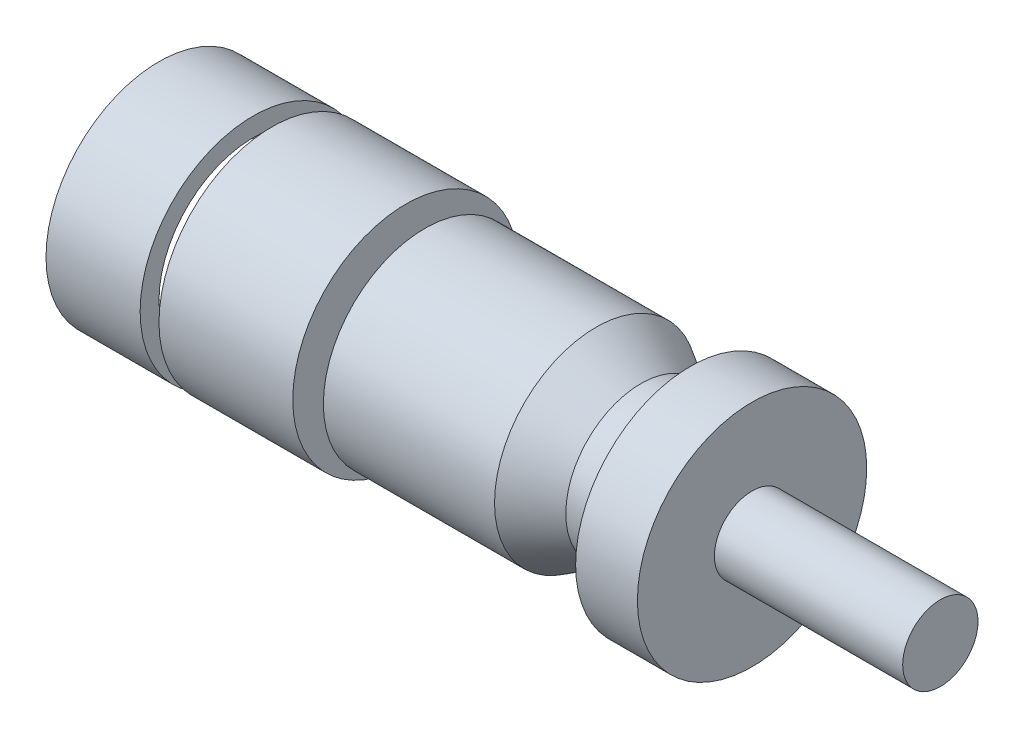
ISO-10303-21;
HEADER;
FILE_DESCRIPTION(('STEP AP214'),'2;1');
FILE_NAME('part.step','',(''),(''),'','','');
FILE_SCHEMA(('AUTOMOTIVE_DESIGN { 1 0 10303 214 1 1 1 1 }'));
ENDSEC;
DATA;
#1=APPLICATION_CONTEXT('core data for automotive mechanical design processes');
#2=APPLICATION_PROTOCOL_DEFINITION('international standard','automotive_design',2000,#1);
#3=PRODUCT_CONTEXT('',#1,'mechanical');
#4=PRODUCT('Part','Part','',(#3));
#5=PRODUCT_RELATED_PRODUCT_CATEGORY('part','',(#4));
#6=PRODUCT_DEFINITION_FORMATION('','',#4);
#7=PRODUCT_DEFINITION_CONTEXT('part definition',#1,'design');
#8=PRODUCT_DEFINITION('design','',#6,#7);
#9=PRODUCT_DEFINITION_SHAPE('','',#8);
#10=(LENGTH_UNIT() NAMED_UNIT(*) SI_UNIT(.MILLI.,.METRE.));
#11=(NAMED_UNIT(*) PLANE_ANGLE_UNIT() SI_UNIT($,.RADIAN.));
#12=(NAMED_UNIT(*) SI_UNIT($,.STERADIAN.) SOLID_ANGLE_UNIT());
#13=UNCERTAINTY_MEASURE_WITH_UNIT(LENGTH_MEASURE(1.E-05),#10,'distance_accuracy_value','');
#14=(GEOMETRIC_REPRESENTATION_CONTEXT(3) GLOBAL_UNCERTAINTY_ASSIGNED_CONTEXT((#13)) GLOBAL_UNIT_ASSIGNED_CONTEXT((#10,
#11,#12)) REPRESENTATION_CONTEXT('',''));
#15=CARTESIAN_POINT('',(0.,0.,0.));
#16=DIRECTION('',(0.,0.,1.));
#17=DIRECTION('',(1.,0.,0.));
#18=AXIS2_PLACEMENT_3D('',#15,#16,#17);
#19=CARTESIAN_POINT('',(63.,12.1795573404222,0.));
#20=DIRECTION('',(-1.,0.,0.));
#21=DIRECTION('',(0.,0.,1.));
#22=AXIS2_PLACEMENT_3D('',#19,#20,#21);
#23=PLANE('',#22);
#24=CARTESIAN_POINT('',(63.,0.,0.));
#25=DIRECTION('',(-1.,0.,0.));
#26=DIRECTION('',(0.,0.,1.));
#27=AXIS2_PLACEMENT_3D('',#24,#25,#26);
#28=CIRCLE('',#27,12.1795573404222);
#29=CARTESIAN_POINT('',(63.,0.,12.1795573404222));
#30=VERTEX_POINT('',#29);
#31=EDGE_CURVE('E52',#30,#30,#28,.T.);
#32=ORIENTED_EDGE('',*,*,#31,.F.);
#33=EDGE_LOOP('',(#32));
#34=FACE_BOUND('',#33,.T.);
#35=CARTESIAN_POINT('',(63.,0.,0.));
#36=DIRECTION('',(-1.,0.,0.));
#37=DIRECTION('',(0.,0.,1.));
#38=AXIS2_PLACEMENT_3D('',#35,#36,#37);
#39=CIRCLE('',#38,4.);
#40=CARTESIAN_POINT('',(63.,0.,4.));
#41=VERTEX_POINT('',#40);
#42=EDGE_CURVE('E11',#41,#41,#39,.F.);
#43=ORIENTED_EDGE('',*,*,#42,.F.);
#44=EDGE_LOOP('',(#43));
#45=FACE_BOUND('',#44,.T.);
#46=ADVANCED_FACE('F41',(#34,#45),#23,.F.);
#47=CARTESIAN_POINT('',(0.,0.,0.));
#48=DIRECTION('',(-1.,0.,0.));
#49=DIRECTION('',(0.,0.,1.));
#50=AXIS2_PLACEMENT_3D('',#47,#48,#49);
#51=CYLINDRICAL_SURFACE('',#50,5.17137842644598);
#52=CARTESIAN_POINT('',(10.,0.,0.));
#53=DIRECTION('',(-1.,0.,0.));
#54=DIRECTION('',(0.,0.,1.));
#55=AXIS2_PLACEMENT_3D('',#52,#53,#54);
#56=CIRCLE('',#55,5.17137842644598);
#57=CARTESIAN_POINT('',(10.,0.,5.17137842644598));
#58=VERTEX_POINT('',#57);
#59=EDGE_CURVE('E48',#58,#58,#56,.T.);
#60=ORIENTED_EDGE('',*,*,#59,.F.);
#61=EDGE_LOOP('',(#60));
#62=FACE_BOUND('',#61,.T.);
#63=CARTESIAN_POINT('',(12.,0.,0.));
#64=DIRECTION('',(-1.,0.,0.));
#65=DIRECTION('',(0.,0.,1.));
#66=AXIS2_PLACEMENT_3D('',#63,#64,#65);
#67=CIRCLE('',#66,5.17137842644598);
#68=CARTESIAN_POINT('',(12.,0.,5.17137842644598));
#69=VERTEX_POINT('',#68);
#70=EDGE_CURVE('E85',#69,#69,#67,.T.);
#71=ORIENTED_EDGE('',*,*,#70,.T.);
#72=EDGE_LOOP('',(#71));
#73=FACE_BOUND('',#72,.T.);
#74=ADVANCED_FACE('F106',(#62,#73),#51,.T.);
#75=CARTESIAN_POINT('',(12.,5.17137842644598,0.));
#76=DIRECTION('',(1.,0.,0.));
#77=DIRECTION('',(0.,0.,-1.));
#78=AXIS2_PLACEMENT_3D('',#75,#76,#77);
#79=PLANE('',#78);
#80=ORIENTED_EDGE('',*,*,#70,.F.);
#81=EDGE_LOOP('',(#80));
#82=FACE_BOUND('',#81,.T.);
#83=CARTESIAN_POINT('',(12.,0.,0.));
#84=DIRECTION('',(-1.,0.,0.));
#85=DIRECTION('',(0.,0.,1.));
#86=AXIS2_PLACEMENT_3D('',#83,#84,#85);
#87=CIRCLE('',#86,12.);
#88=CARTESIAN_POINT('',(12.,0.,12.));
#89=VERTEX_POINT('',#88);
#90=EDGE_CURVE('E82',#89,#89,#87,.T.);
#91=ORIENTED_EDGE('',*,*,#90,.T.);
#92=EDGE_LOOP('',(#91));
#93=FACE_BOUND('',#92,.T.);
#94=ADVANCED_FACE('F112',(#82,#93),#79,.F.);
#95=CARTESIAN_POINT('',(0.,0.,0.));
#96=DIRECTION('',(-1.,0.,0.));
#97=DIRECTION('',(0.,0.,1.));
#98=AXIS2_PLACEMENT_3D('',#95,#96,#97);
#99=CYLINDRICAL_SURFACE('',#98,12.);
#100=ORIENTED_EDGE('',*,*,#90,.F.);
#101=EDGE_LOOP('',(#100));
#102=FACE_BOUND('',#101,.T.);
#103=CARTESIAN_POINT('',(26.2135902893891,0.,0.));
#104=DIRECTION('',(-1.,0.,0.));
#105=DIRECTION('',(0.,0.,1.));
#106=AXIS2_PLACEMENT_3D('',#103,#104,#105);
#107=CIRCLE('',#106,12.);
#108=CARTESIAN_POINT('',(26.2135902893891,0.,12.));
#109=VERTEX_POINT('',#108);
#110=EDGE_CURVE('E79',#109,#109,#107,.T.);
#111=ORIENTED_EDGE('',*,*,#110,.T.);
#112=EDGE_LOOP('',(#111));
#113=FACE_BOUND('',#112,.T.);
#114=ADVANCED_FACE('F147',(#102,#113),#99,.T.);
#115=CARTESIAN_POINT('',(26.2135902893891,12.,0.));
#116=DIRECTION('',(-1.,0.,0.));
#117=DIRECTION('',(0.,0.,1.));
#118=AXIS2_PLACEMENT_3D('',#115,#116,#117);
#119=PLANE('',#118);
#120=ORIENTED_EDGE('',*,*,#110,.F.);
#121=EDGE_LOOP('',(#120));
#122=FACE_BOUND('',#121,.T.);
#123=CARTESIAN_POINT('',(26.2135902893891,0.,0.));
#124=DIRECTION('',(-1.,0.,0.));
#125=DIRECTION('',(0.,0.,1.));
#126=AXIS2_PLACEMENT_3D('',#123,#124,#125);
#127=CIRCLE('',#126,5.17137842644598);
#128=CARTESIAN_POINT('',(26.2135902893891,0.,5.17137842644598));
#129=VERTEX_POINT('',#128);
#130=EDGE_CURVE('E76',#129,#129,#127,.T.);
#131=ORIENTED_EDGE('',*,*,#130,.T.);
#132=EDGE_LOOP('',(#131));
#133=FACE_BOUND('',#132,.T.);
#134=ADVANCED_FACE('F143',(#122,#133),#119,.F.);
#135=CARTESIAN_POINT('',(0.,0.,0.));
#136=DIRECTION('',(-1.,0.,0.));
#137=DIRECTION('',(0.,0.,1.));
#138=AXIS2_PLACEMENT_3D('',#135,#136,#137);
#139=CYLINDRICAL_SURFACE('',#138,5.17137842644598);
#140=ORIENTED_EDGE('',*,*,#130,.F.);
#141=EDGE_LOOP('',(#140));
#142=FACE_BOUND('',#141,.T.);
#143=CARTESIAN_POINT('',(28.2581179786321,0.,0.));
#144=DIRECTION('',(-1.,0.,0.));
#145=DIRECTION('',(0.,0.,1.));
#146=AXIS2_PLACEMENT_3D('',#143,#144,#145);
#147=CIRCLE('',#146,5.17137842644598);
#148=CARTESIAN_POINT('',(28.2581179786321,0.,5.17137842644598));
#149=VERTEX_POINT('',#148);
#150=EDGE_CURVE('E73',#149,#149,#147,.T.);
#151=ORIENTED_EDGE('',*,*,#150,.T.);
#152=EDGE_LOOP('',(#151));
#153=FACE_BOUND('',#152,.T.);
#154=ADVANCED_FACE('F139',(#142,#153),#139,.T.);
#155=CARTESIAN_POINT('',(28.2581179786321,5.17137842644598,0.));
#156=DIRECTION('',(1.,0.,0.));
#157=DIRECTION('',(0.,0.,-1.));
#158=AXIS2_PLACEMENT_3D('',#155,#156,#157);
#159=PLANE('',#158);
#160=ORIENTED_EDGE('',*,*,#150,.F.);
#161=EDGE_LOOP('',(#160));
#162=FACE_BOUND('',#161,.T.);
#163=CARTESIAN_POINT('',(28.2581179786321,0.,0.));
#164=DIRECTION('',(-1.,0.,0.));
#165=DIRECTION('',(0.,0.,1.));
#166=AXIS2_PLACEMENT_3D('',#163,#164,#165);
#167=CIRCLE('',#166,10.7951880008785);
#168=CARTESIAN_POINT('',(28.2581179786321,0.,10.7951880008785));
#169=VERTEX_POINT('',#168);
#170=EDGE_CURVE('E70',#169,#169,#167,.T.);
#171=ORIENTED_EDGE('',*,*,#170,.T.);
#172=EDGE_LOOP('',(#171));
#173=FACE_BOUND('',#172,.T.);
#174=ADVANCED_FACE('F135',(#162,#173),#159,.F.);
#175=CARTESIAN_POINT('',(0.,0.,0.));
#176=DIRECTION('',(-1.,0.,0.));
#177=DIRECTION('',(0.,0.,1.));
#178=AXIS2_PLACEMENT_3D('',#175,#176,#177);
#179=CYLINDRICAL_SURFACE('',#178,10.7951880008785);
#180=ORIENTED_EDGE('',*,*,#170,.F.);
#181=EDGE_LOOP('',(#180));
#182=FACE_BOUND('',#181,.T.);
#183=CARTESIAN_POINT('',(46.4383051191294,0.,0.));
#184=DIRECTION('',(-1.,0.,0.));
#185=DIRECTION('',(0.,0.,1.));
#186=AXIS2_PLACEMENT_3D('',#183,#184,#185);
#187=CIRCLE('',#186,10.7951880008785);
#188=CARTESIAN_POINT('',(46.4383051191294,0.,10.7951880008785));
#189=VERTEX_POINT('',#188);
#190=EDGE_CURVE('E67',#189,#189,#187,.T.);
#191=ORIENTED_EDGE('',*,*,#190,.T.);
#192=EDGE_LOOP('',(#191));
#193=FACE_BOUND('',#192,.T.);
#194=ADVANCED_FACE('F131',(#182,#193),#179,.T.);
#195=CARTESIAN_POINT('',(51.1946219555419,0.,0.));
#196=DIRECTION('',(-1.,0.,0.));
#197=DIRECTION('',(0.,0.,1.));
#198=AXIS2_PLACEMENT_3D('',#195,#196,#197);
#199=CONICAL_SURFACE('',#198,7.98110914310926,0.534257794337086);
#200=ORIENTED_EDGE('',*,*,#190,.F.);
#201=EDGE_LOOP('',(#200));
#202=FACE_BOUND('',#201,.T.);
#203=CARTESIAN_POINT('',(51.1946219555419,0.,0.));
#204=DIRECTION('',(-1.,0.,0.));
#205=DIRECTION('',(0.,0.,1.));
#206=AXIS2_PLACEMENT_3D('',#203,#204,#205);
#207=CIRCLE('',#206,7.98110914310926);
#208=CARTESIAN_POINT('',(51.1946219555419,0.,7.98110914310926));
#209=VERTEX_POINT('',#208);
#210=EDGE_CURVE('E64',#209,#209,#207,.T.);
#211=ORIENTED_EDGE('',*,*,#210,.T.);
#212=EDGE_LOOP('',(#211));
#213=FACE_BOUND('',#212,.T.);
#214=ADVANCED_FACE('F127',(#202,#213),#199,.T.);
#215=CARTESIAN_POINT('',(0.,0.,0.));
#216=DIRECTION('',(-1.,0.,0.));
#217=DIRECTION('',(0.,0.,1.));
#218=AXIS2_PLACEMENT_3D('',#215,#216,#217);
#219=CYLINDRICAL_SURFACE('',#218,7.98110914310926);
#220=ORIENTED_EDGE('',*,*,#210,.F.);
#221=EDGE_LOOP('',(#220));
#222=FACE_BOUND('',#221,.T.);
#223=CARTESIAN_POINT('',(56.4378467619837,0.,0.));
#224=DIRECTION('',(-1.,0.,0.));
#225=DIRECTION('',(0.,0.,1.));
#226=AXIS2_PLACEMENT_3D('',#223,#224,#225);
#227=CIRCLE('',#226,7.98110914310926);
#228=CARTESIAN_POINT('',(56.4378467619837,0.,7.98110914310926));
#229=VERTEX_POINT('',#228);
#230=EDGE_CURVE('E61',#229,#229,#227,.T.);
#231=ORIENTED_EDGE('',*,*,#230,.T.);
#232=EDGE_LOOP('',(#231));
#233=FACE_BOUND('',#232,.T.);
#234=ADVANCED_FACE('F123',(#222,#233),#219,.T.);
#235=CARTESIAN_POINT('',(56.4378467619837,7.98110914310926,0.));
#236=DIRECTION('',(1.,0.,0.));
#237=DIRECTION('',(0.,0.,-1.));
#238=AXIS2_PLACEMENT_3D('',#235,#236,#237);
#239=PLANE('',#238);
#240=ORIENTED_EDGE('',*,*,#230,.F.);
#241=EDGE_LOOP('',(#240));
#242=FACE_BOUND('',#241,.T.);
#243=CARTESIAN_POINT('',(56.4378467619837,0.,0.));
#244=DIRECTION('',(-1.,0.,0.));
#245=DIRECTION('',(0.,0.,1.));
#246=AXIS2_PLACEMENT_3D('',#243,#244,#245);
#247=CIRCLE('',#246,12.1795573404222);
#248=CARTESIAN_POINT('',(56.4378467619837,0.,12.1795573404222));
#249=VERTEX_POINT('',#248);
#250=EDGE_CURVE('E56',#249,#249,#247,.T.);
#251=ORIENTED_EDGE('',*,*,#250,.T.);
#252=EDGE_LOOP('',(#251));
#253=FACE_BOUND('',#252,.T.);
#254=ADVANCED_FACE('F119',(#242,#253),#239,.F.);
#255=CARTESIAN_POINT('',(0.,0.,0.));
#256=DIRECTION('',(-1.,0.,0.));
#257=DIRECTION('',(0.,0.,1.));
#258=AXIS2_PLACEMENT_3D('',#255,#256,#257);
#259=CYLINDRICAL_SURFACE('',#258,12.1795573404222);
#260=ORIENTED_EDGE('',*,*,#250,.F.);
#261=EDGE_LOOP('',(#260));
#262=FACE_BOUND('',#261,.T.);
#263=ORIENTED_EDGE('',*,*,#31,.T.);
#264=EDGE_LOOP('',(#263));
#265=FACE_BOUND('',#264,.T.);
#266=ADVANCED_FACE('F103',(#262,#265),#259,.T.);
#267=CARTESIAN_POINT('',(10.,0.,0.));
#268=DIRECTION('',(-1.,0.,0.));
#269=DIRECTION('',(0.,0.,1.));
#270=AXIS2_PLACEMENT_3D('',#267,#268,#269);
#271=PLANE('',#270);
#272=ORIENTED_EDGE('',*,*,#59,.T.);
#273=EDGE_LOOP('',(#272));
#274=FACE_BOUND('',#273,.T.);
#275=ADVANCED_FACE('F43',(#274),#271,.T.);
#276=CARTESIAN_POINT('',(83.,0.,0.));
#277=DIRECTION('',(-1.,0.,0.));
#278=DIRECTION('',(0.,0.,1.));
#279=AXIS2_PLACEMENT_3D('',#276,#277,#278);
#280=CYLINDRICAL_SURFACE('',#279,4.);
#281=CARTESIAN_POINT('',(83.,0.,0.));
#282=DIRECTION('',(1.,0.,0.));
#283=DIRECTION('',(0.,0.,-1.));
#284=AXIS2_PLACEMENT_3D('',#281,#282,#283);
#285=CIRCLE('',#284,4.);
#286=CARTESIAN_POINT('',(83.,0.,-4.));
#287=VERTEX_POINT('',#286);
#288=EDGE_CURVE('E88',#287,#287,#285,.T.);
#289=ORIENTED_EDGE('',*,*,#288,.F.);
#290=EDGE_LOOP('',(#289));
#291=FACE_BOUND('',#290,.T.);
#292=ORIENTED_EDGE('',*,*,#42,.T.);
#293=EDGE_LOOP('',(#292));
#294=FACE_BOUND('',#293,.T.);
#295=ADVANCED_FACE('F94',(#291,#294),#280,.T.);
#296=CARTESIAN_POINT('',(83.,0.,0.));
#297=DIRECTION('',(1.,0.,0.));
#298=DIRECTION('',(0.,0.,-1.));
#299=AXIS2_PLACEMENT_3D('',#296,#297,#298);
#300=PLANE('',#299);
#301=ORIENTED_EDGE('',*,*,#288,.T.);
#302=EDGE_LOOP('',(#301));
#303=FACE_BOUND('',#302,.T.);
#304=ADVANCED_FACE('F92',(#303),#300,.T.);
#305=CLOSED_SHELL('',(#46,#74,#94,#114,#134,#154,#174,#194,#214,#234,#254,#266,#275,#295,#304));
#306=MANIFOLD_SOLID_BREP('B2',#305);
#307=CARTESIAN_POINT('',(0.,0.,0.));
#308=DIRECTION('',(1.,0.,0.));
#309=DIRECTION('',(0.,0.,-1.));
#310=AXIS2_PLACEMENT_3D('',#307,#308,#309);
#311=PLANE('',#310);
#312=CARTESIAN_POINT('',(0.,0.,0.));
#313=DIRECTION('',(-1.,0.,0.));
#314=DIRECTION('',(0.,0.,1.));
#315=AXIS2_PLACEMENT_3D('',#312,#313,#314);
#316=CIRCLE('',#315,10.);
#317=CARTESIAN_POINT('',(0.,0.,10.));
#318=VERTEX_POINT('',#317);
#319=EDGE_CURVE('E275',#318,#318,#316,.T.);
#320=ORIENTED_EDGE('',*,*,#319,.F.);
#321=EDGE_LOOP('',(#320));
#322=FACE_BOUND('',#321,.T.);
#323=CARTESIAN_POINT('',(0.,0.,0.));
#324=DIRECTION('',(-1.,0.,0.));
#325=DIRECTION('',(0.,0.,1.));
#326=AXIS2_PLACEMENT_3D('',#323,#324,#325);
#327=CIRCLE('',#326,12.);
#328=CARTESIAN_POINT('',(0.,0.,12.));
#329=VERTEX_POINT('',#328);
#330=EDGE_CURVE('E40',#329,#329,#327,.T.);
#331=ORIENTED_EDGE('',*,*,#330,.T.);
#332=EDGE_LOOP('',(#331));
#333=FACE_BOUND('',#332,.T.);
#334=ADVANCED_FACE('F261',(#322,#333),#311,.F.);
#335=CARTESIAN_POINT('',(0.,0.,0.));
#336=DIRECTION('',(-1.,0.,0.));
#337=DIRECTION('',(0.,0.,1.));
#338=AXIS2_PLACEMENT_3D('',#335,#336,#337);
#339=CYLINDRICAL_SURFACE('',#338,12.);
#340=ORIENTED_EDGE('',*,*,#330,.F.);
#341=EDGE_LOOP('',(#340));
#342=FACE_BOUND('',#341,.T.);
#343=CARTESIAN_POINT('',(10.,0.,0.));
#344=DIRECTION('',(-1.,0.,0.));
#345=DIRECTION('',(0.,0.,1.));
#346=AXIS2_PLACEMENT_3D('',#343,#344,#345);
#347=CIRCLE('',#346,12.);
#348=CARTESIAN_POINT('',(10.,0.,12.));
#349=VERTEX_POINT('',#348);
#350=EDGE_CURVE('E267',#349,#349,#347,.T.);
#351=ORIENTED_EDGE('',*,*,#350,.T.);
#352=EDGE_LOOP('',(#351));
#353=FACE_BOUND('',#352,.T.);
#354=ADVANCED_FACE('F284',(#342,#353),#339,.T.);
#355=CARTESIAN_POINT('',(10.,12.,0.));
#356=DIRECTION('',(-1.,0.,0.));
#357=DIRECTION('',(0.,0.,1.));
#358=AXIS2_PLACEMENT_3D('',#355,#356,#357);
#359=PLANE('',#358);
#360=CARTESIAN_POINT('',(10.,0.,0.));
#361=DIRECTION('',(-1.,0.,0.));
#362=DIRECTION('',(0.,0.,1.));
#363=AXIS2_PLACEMENT_3D('',#360,#361,#362);
#364=CIRCLE('',#363,10.);
#365=CARTESIAN_POINT('',(10.,0.,10.));
#366=VERTEX_POINT('',#365);
#367=EDGE_CURVE('E271',#366,#366,#364,.T.);
#368=ORIENTED_EDGE('',*,*,#367,.T.);
#369=EDGE_LOOP('',(#368));
#370=FACE_BOUND('',#369,.T.);
#371=ORIENTED_EDGE('',*,*,#350,.F.);
#372=EDGE_LOOP('',(#371));
#373=FACE_BOUND('',#372,.T.);
#374=ADVANCED_FACE('F288',(#370,#373),#359,.F.);
#375=CARTESIAN_POINT('',(10.,0.,0.));
#376=DIRECTION('',(-1.,0.,0.));
#377=DIRECTION('',(0.,0.,1.));
#378=AXIS2_PLACEMENT_3D('',#375,#376,#377);
#379=CYLINDRICAL_SURFACE('',#378,10.);
#380=ORIENTED_EDGE('',*,*,#367,.F.);
#381=EDGE_LOOP('',(#380));
#382=FACE_BOUND('',#381,.T.);
#383=ORIENTED_EDGE('',*,*,#319,.T.);
#384=EDGE_LOOP('',(#383));
#385=FACE_BOUND('',#384,.T.);
#386=ADVANCED_FACE('F281',(#382,#385),#379,.F.);
#387=CLOSED_SHELL('',(#334,#354,#374,#386));
#388=MANIFOLD_SOLID_BREP('B6',#387);
#389=ADVANCED_BREP_SHAPE_REPRESENTATION('',(#18,#306,#388),#14);
#390=SHAPE_DEFINITION_REPRESENTATION(#9,#389);
ENDSEC;
END-ISO-10303-21;
